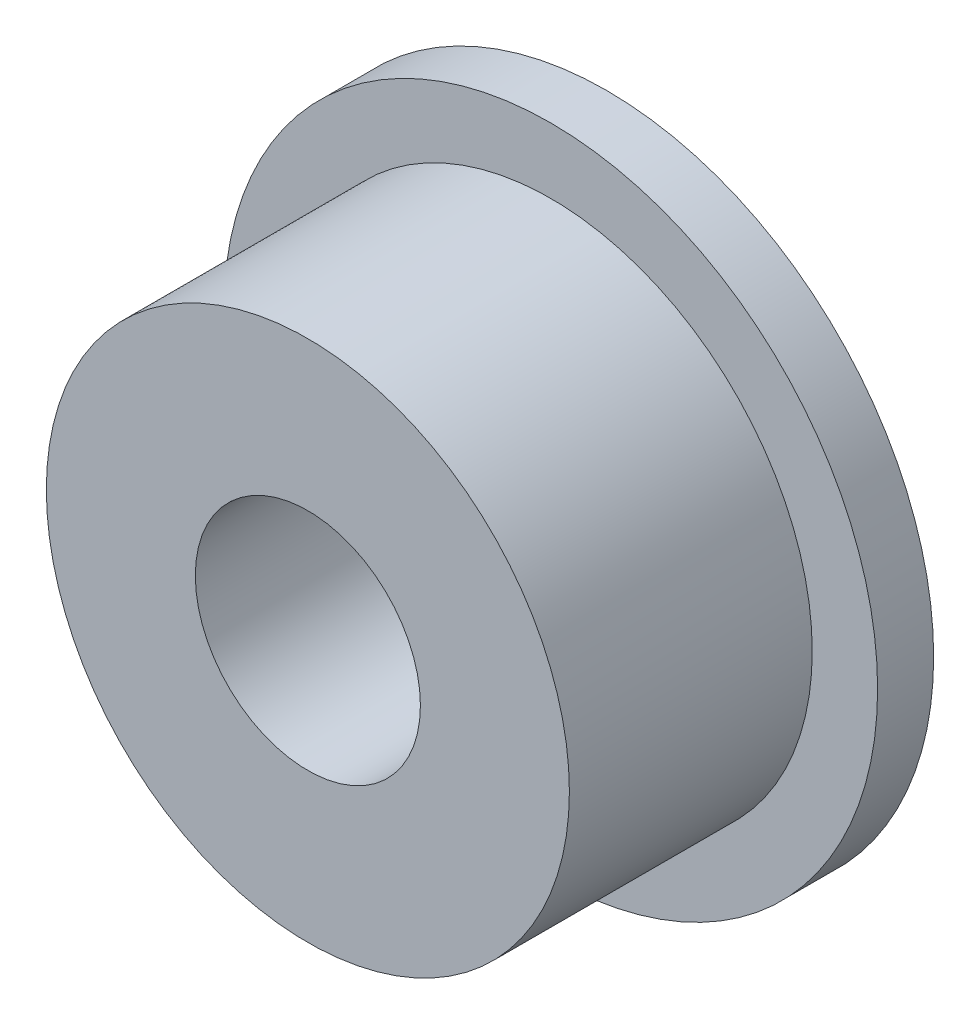
ISO-10303-21;
HEADER;
FILE_DESCRIPTION(('STEP AP214'),'2;1');
FILE_NAME('part.step','',(''),(''),'','','');
FILE_SCHEMA(('AUTOMOTIVE_DESIGN { 1 0 10303 214 1 1 1 1 }'));
ENDSEC;
DATA;
#1=APPLICATION_CONTEXT('core data for automotive mechanical design processes');
#2=APPLICATION_PROTOCOL_DEFINITION('international standard','automotive_design',2000,#1);
#3=PRODUCT_CONTEXT('',#1,'mechanical');
#4=PRODUCT('Part','Part','',(#3));
#5=PRODUCT_RELATED_PRODUCT_CATEGORY('part','',(#4));
#6=PRODUCT_DEFINITION_FORMATION('','',#4);
#7=PRODUCT_DEFINITION_CONTEXT('part definition',#1,'design');
#8=PRODUCT_DEFINITION('design','',#6,#7);
#9=PRODUCT_DEFINITION_SHAPE('','',#8);
#10=(LENGTH_UNIT() NAMED_UNIT(*) SI_UNIT(.MILLI.,.METRE.));
#11=(NAMED_UNIT(*) PLANE_ANGLE_UNIT() SI_UNIT($,.RADIAN.));
#12=(NAMED_UNIT(*) SI_UNIT($,.STERADIAN.) SOLID_ANGLE_UNIT());
#13=UNCERTAINTY_MEASURE_WITH_UNIT(LENGTH_MEASURE(1.E-05),#10,'distance_accuracy_value','');
#14=(GEOMETRIC_REPRESENTATION_CONTEXT(3) GLOBAL_UNCERTAINTY_ASSIGNED_CONTEXT((#13)) GLOBAL_UNIT_ASSIGNED_CONTEXT((#10,
#11,#12)) REPRESENTATION_CONTEXT('',''));
#15=CARTESIAN_POINT('',(0.,0.,0.));
#16=DIRECTION('',(0.,0.,1.));
#17=DIRECTION('',(1.,0.,0.));
#18=AXIS2_PLACEMENT_3D('',#15,#16,#17);
#19=CARTESIAN_POINT('',(0.,0.,16.));
#20=DIRECTION('',(0.,0.,1.));
#21=DIRECTION('',(1.,0.,0.));
#22=AXIS2_PLACEMENT_3D('',#19,#20,#21);
#23=PLANE('',#22);
#24=CARTESIAN_POINT('',(0.,0.,16.));
#25=DIRECTION('',(0.,0.,1.));
#26=DIRECTION('',(1.,0.,0.));
#27=AXIS2_PLACEMENT_3D('',#24,#25,#26);
#28=CIRCLE('',#27,14.);
#29=CARTESIAN_POINT('',(14.,0.,16.));
#30=VERTEX_POINT('',#29);
#31=EDGE_CURVE('E10',#30,#30,#28,.T.);
#32=ORIENTED_EDGE('',*,*,#31,.T.);
#33=EDGE_LOOP('',(#32));
#34=FACE_BOUND('',#33,.T.);
#35=CARTESIAN_POINT('',(0.,0.,16.));
#36=DIRECTION('',(0.,0.,1.));
#37=DIRECTION('',(1.,0.,0.));
#38=AXIS2_PLACEMENT_3D('',#35,#36,#37);
#39=CIRCLE('',#38,6.025);
#40=CARTESIAN_POINT('',(6.025,0.,16.));
#41=VERTEX_POINT('',#40);
#42=EDGE_CURVE('E48',#41,#41,#39,.T.);
#43=ORIENTED_EDGE('',*,*,#42,.F.);
#44=EDGE_LOOP('',(#43));
#45=FACE_BOUND('',#44,.T.);
#46=ADVANCED_FACE('F41',(#34,#45),#23,.T.);
#47=CARTESIAN_POINT('',(0.,0.,0.));
#48=DIRECTION('',(0.,0.,1.));
#49=DIRECTION('',(1.,0.,0.));
#50=AXIS2_PLACEMENT_3D('',#47,#48,#49);
#51=PLANE('',#50);
#52=CARTESIAN_POINT('',(0.,0.,0.));
#53=DIRECTION('',(0.,0.,1.));
#54=DIRECTION('',(1.,0.,0.));
#55=AXIS2_PLACEMENT_3D('',#52,#53,#54);
#56=CIRCLE('',#55,6.025);
#57=CARTESIAN_POINT('',(6.025,0.,0.));
#58=VERTEX_POINT('',#57);
#59=EDGE_CURVE('E52',#58,#58,#56,.T.);
#60=ORIENTED_EDGE('',*,*,#59,.T.);
#61=EDGE_LOOP('',(#60));
#62=FACE_BOUND('',#61,.T.);
#63=CARTESIAN_POINT('',(0.,0.,0.));
#64=DIRECTION('',(0.,0.,1.));
#65=DIRECTION('',(1.,0.,0.));
#66=AXIS2_PLACEMENT_3D('',#63,#64,#65);
#67=CIRCLE('',#66,17.5);
#68=CARTESIAN_POINT('',(17.5,0.,0.));
#69=VERTEX_POINT('',#68);
#70=EDGE_CURVE('E62',#69,#69,#67,.T.);
#71=ORIENTED_EDGE('',*,*,#70,.F.);
#72=EDGE_LOOP('',(#71));
#73=FACE_BOUND('',#72,.T.);
#74=ADVANCED_FACE('F77',(#62,#73),#51,.F.);
#75=CARTESIAN_POINT('',(0.,0.,16.));
#76=DIRECTION('',(0.,0.,-1.));
#77=DIRECTION('',(-1.,0.,0.));
#78=AXIS2_PLACEMENT_3D('',#75,#76,#77);
#79=CYLINDRICAL_SURFACE('',#78,14.);
#80=CARTESIAN_POINT('',(0.,0.,3.));
#81=DIRECTION('',(0.,0.,1.));
#82=DIRECTION('',(1.,0.,0.));
#83=AXIS2_PLACEMENT_3D('',#80,#81,#82);
#84=CIRCLE('',#83,14.);
#85=CARTESIAN_POINT('',(14.,0.,3.));
#86=VERTEX_POINT('',#85);
#87=EDGE_CURVE('E57',#86,#86,#84,.T.);
#88=ORIENTED_EDGE('',*,*,#87,.T.);
#89=EDGE_LOOP('',(#88));
#90=FACE_BOUND('',#89,.T.);
#91=ORIENTED_EDGE('',*,*,#31,.F.);
#92=EDGE_LOOP('',(#91));
#93=FACE_BOUND('',#92,.T.);
#94=ADVANCED_FACE('F43',(#90,#93),#79,.T.);
#95=CARTESIAN_POINT('',(0.,0.,16.));
#96=DIRECTION('',(0.,0.,-1.));
#97=DIRECTION('',(-1.,0.,0.));
#98=AXIS2_PLACEMENT_3D('',#95,#96,#97);
#99=CYLINDRICAL_SURFACE('',#98,6.025);
#100=ORIENTED_EDGE('',*,*,#42,.T.);
#101=EDGE_LOOP('',(#100));
#102=FACE_BOUND('',#101,.T.);
#103=ORIENTED_EDGE('',*,*,#59,.F.);
#104=EDGE_LOOP('',(#103));
#105=FACE_BOUND('',#104,.T.);
#106=ADVANCED_FACE('F84',(#102,#105),#99,.F.);
#107=CARTESIAN_POINT('',(0.,0.,3.));
#108=DIRECTION('',(0.,0.,1.));
#109=DIRECTION('',(1.,0.,0.));
#110=AXIS2_PLACEMENT_3D('',#107,#108,#109);
#111=PLANE('',#110);
#112=CARTESIAN_POINT('',(0.,0.,3.));
#113=DIRECTION('',(0.,0.,1.));
#114=DIRECTION('',(1.,0.,0.));
#115=AXIS2_PLACEMENT_3D('',#112,#113,#114);
#116=CIRCLE('',#115,17.5);
#117=CARTESIAN_POINT('',(17.5,0.,3.));
#118=VERTEX_POINT('',#117);
#119=EDGE_CURVE('E61',#118,#118,#116,.T.);
#120=ORIENTED_EDGE('',*,*,#119,.T.);
#121=EDGE_LOOP('',(#120));
#122=FACE_BOUND('',#121,.T.);
#123=ORIENTED_EDGE('',*,*,#87,.F.);
#124=EDGE_LOOP('',(#123));
#125=FACE_BOUND('',#124,.T.);
#126=ADVANCED_FACE('F68',(#122,#125),#111,.T.);
#127=CARTESIAN_POINT('',(0.,0.,3.));
#128=DIRECTION('',(0.,0.,-1.));
#129=DIRECTION('',(-1.,0.,0.));
#130=AXIS2_PLACEMENT_3D('',#127,#128,#129);
#131=CYLINDRICAL_SURFACE('',#130,17.5);
#132=ORIENTED_EDGE('',*,*,#119,.F.);
#133=EDGE_LOOP('',(#132));
#134=FACE_BOUND('',#133,.T.);
#135=ORIENTED_EDGE('',*,*,#70,.T.);
#136=EDGE_LOOP('',(#135));
#137=FACE_BOUND('',#136,.T.);
#138=ADVANCED_FACE('F71',(#134,#137),#131,.T.);
#139=CLOSED_SHELL('',(#46,#74,#94,#106,#126,#138));
#140=MANIFOLD_SOLID_BREP('B2',#139);
#141=ADVANCED_BREP_SHAPE_REPRESENTATION('',(#18,#140),#14);
#142=SHAPE_DEFINITION_REPRESENTATION(#9,#141);
ENDSEC;
END-ISO-10303-21;
